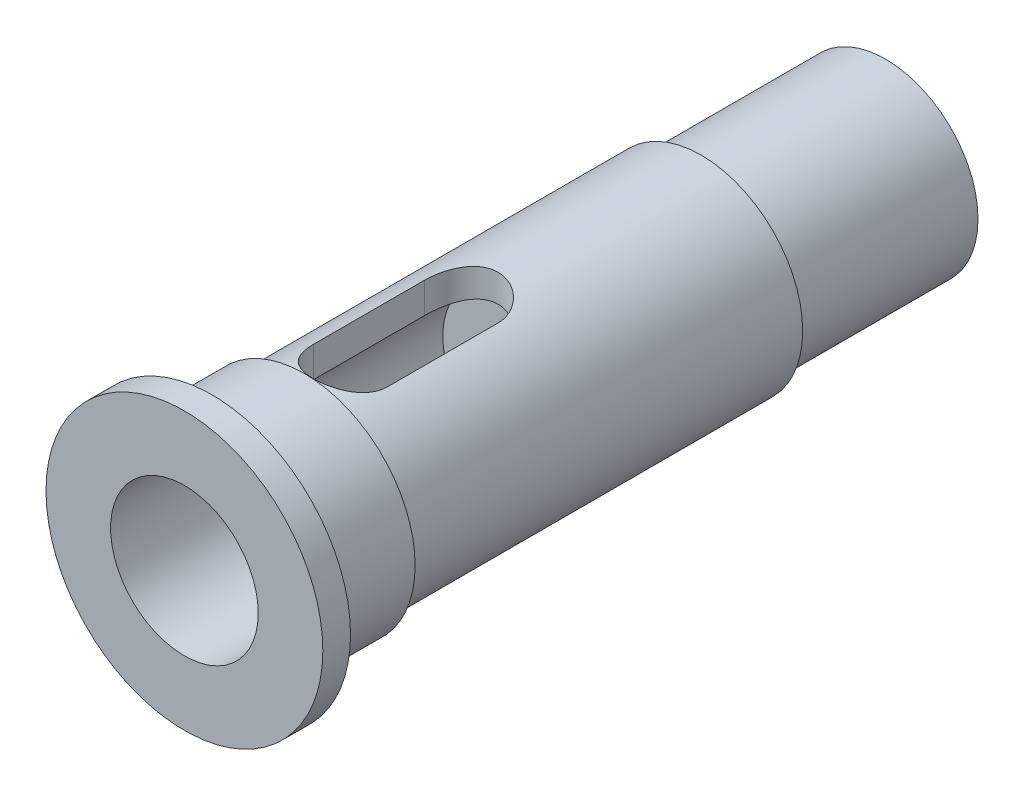
ISO-10303-21;
HEADER;
FILE_DESCRIPTION(('STEP AP214'),'2;1');
FILE_NAME('part.step','',(''),(''),'','','');
FILE_SCHEMA(('AUTOMOTIVE_DESIGN { 1 0 10303 214 1 1 1 1 }'));
ENDSEC;
DATA;
#1=APPLICATION_CONTEXT('core data for automotive mechanical design processes');
#2=APPLICATION_PROTOCOL_DEFINITION('international standard','automotive_design',2000,#1);
#3=PRODUCT_CONTEXT('',#1,'mechanical');
#4=PRODUCT('Part','Part','',(#3));
#5=PRODUCT_RELATED_PRODUCT_CATEGORY('part','',(#4));
#6=PRODUCT_DEFINITION_FORMATION('','',#4);
#7=PRODUCT_DEFINITION_CONTEXT('part definition',#1,'design');
#8=PRODUCT_DEFINITION('design','',#6,#7);
#9=PRODUCT_DEFINITION_SHAPE('','',#8);
#10=(LENGTH_UNIT() NAMED_UNIT(*) SI_UNIT(.MILLI.,.METRE.));
#11=(NAMED_UNIT(*) PLANE_ANGLE_UNIT() SI_UNIT($,.RADIAN.));
#12=(NAMED_UNIT(*) SI_UNIT($,.STERADIAN.) SOLID_ANGLE_UNIT());
#13=UNCERTAINTY_MEASURE_WITH_UNIT(LENGTH_MEASURE(1.E-05),#10,'distance_accuracy_value','');
#14=(GEOMETRIC_REPRESENTATION_CONTEXT(3) GLOBAL_UNCERTAINTY_ASSIGNED_CONTEXT((#13)) GLOBAL_UNIT_ASSIGNED_CONTEXT((#10,
#11,#12)) REPRESENTATION_CONTEXT('',''));
#15=CARTESIAN_POINT('',(0.,0.,0.));
#16=DIRECTION('',(0.,0.,1.));
#17=DIRECTION('',(1.,0.,0.));
#18=AXIS2_PLACEMENT_3D('',#15,#16,#17);
#19=CARTESIAN_POINT('',(0.,0.,38.));
#20=DIRECTION('',(0.,0.,-1.));
#21=DIRECTION('',(-1.,0.,0.));
#22=AXIS2_PLACEMENT_3D('',#19,#20,#21);
#23=CYLINDRICAL_SURFACE('',#22,5.5);
#24=CARTESIAN_POINT('',(0.,0.,31.5));
#25=DIRECTION('',(0.,0.,-1.));
#26=DIRECTION('',(-1.,0.,0.));
#27=AXIS2_PLACEMENT_3D('',#24,#25,#26);
#28=CIRCLE('',#27,5.5);
#29=CARTESIAN_POINT('',(-5.5,0.,31.5));
#30=VERTEX_POINT('',#29);
#31=EDGE_CURVE('E135',#30,#30,#28,.T.);
#32=ORIENTED_EDGE('',*,*,#31,.T.);
#33=EDGE_LOOP('',(#32));
#34=FACE_BOUND('',#33,.T.);
#35=DIRECTION('',(0.,0.,-1.));
#36=VECTOR('',#35,1.);
#37=CARTESIAN_POINT('',(-2.,5.1234753829798,38.));
#38=LINE('',#37,#36);
#39=CARTESIAN_POINT('',(-2.,5.1234753829798,29.));
#40=VERTEX_POINT('',#39);
#41=CARTESIAN_POINT('',(-2.,5.1234753829798,23.));
#42=VERTEX_POINT('',#41);
#43=EDGE_CURVE('E125',#40,#42,#38,.T.);
#44=ORIENTED_EDGE('',*,*,#43,.T.);
#45=CARTESIAN_POINT('',(-2.,5.1234753829798,23.));
#46=CARTESIAN_POINT('',(-2.00000753314808,5.12346565602725,22.9457612205785));
#47=CARTESIAN_POINT('',(-1.99779379827408,5.12433643557664,22.8915277993145));
#48=CARTESIAN_POINT('',(-1.98898255908266,5.12776648446225,22.7834886908159));
#49=CARTESIAN_POINT('',(-1.98238644308809,5.13032521905848,22.7296828735791));
#50=CARTESIAN_POINT('',(-1.96489870016483,5.13704737724638,22.6230613621324));
#51=CARTESIAN_POINT('',(-1.95402164560881,5.14120535590845,22.5702429391552));
#52=CARTESIAN_POINT('',(-1.92808800203303,5.15098705807193,22.4657940511534));
#53=CARTESIAN_POINT('',(-1.91303121833357,5.15661084984592,22.4141636415843));
#54=CARTESIAN_POINT('',(-1.86180702208756,5.1754238494232,22.2616619421114));
#55=CARTESIAN_POINT('',(-1.81955567746144,5.19056699295785,22.1629992148658));
#56=CARTESIAN_POINT('',(-1.72018049401623,5.22433904658501,21.974135282703));
#57=CARTESIAN_POINT('',(-1.6630453414404,5.24297060531306,21.8839405859228));
#58=CARTESIAN_POINT('',(-1.53267714707823,5.28258709667612,21.7103626044192));
#59=CARTESIAN_POINT('',(-1.45886670296494,5.30363814939348,21.6274271533525));
#60=CARTESIAN_POINT('',(-1.29847293044523,5.34516826987225,21.4748016084848));
#61=CARTESIAN_POINT('',(-1.21188719525374,5.36564722898827,21.4051140161713));
#62=CARTESIAN_POINT('',(-1.02500969613478,5.40451062749925,21.2788183994836));
#63=CARTESIAN_POINT('',(-0.924370090053192,5.42280793854183,21.2226958146311));
#64=CARTESIAN_POINT('',(-0.714299107302069,5.45445105820857,21.12836416537));
#65=CARTESIAN_POINT('',(-0.604870855549386,5.46779861738183,21.0901487665713));
#66=CARTESIAN_POINT('',(-0.385063057544165,5.48756774300281,21.0342798994265));
#67=CARTESIAN_POINT('',(-0.27490440306594,5.49424962399435,21.0158512598948));
#68=CARTESIAN_POINT('',(-0.0528669835238512,5.50086592457488,20.9976006188544));
#69=CARTESIAN_POINT('',(0.0590112772595836,5.50080228593927,20.9977732627528));
#70=CARTESIAN_POINT('',(0.275772559853019,5.49410312303007,21.0162581100276));
#71=CARTESIAN_POINT('',(0.380738725262411,5.487773764585,21.0337252484304));
#72=CARTESIAN_POINT('',(0.586131937099524,5.46965116666239,21.0848882566854));
#73=CARTESIAN_POINT('',(0.686558725995575,5.45785761761182,21.1185850460306));
#74=CARTESIAN_POINT('',(0.881716601365395,5.42977365386104,21.2016710964535));
#75=CARTESIAN_POINT('',(0.976346250593864,5.41342161172991,21.2512769270653));
#76=CARTESIAN_POINT('',(1.15616748204336,5.37788902184763,21.3645857848175));
#77=CARTESIAN_POINT('',(1.24135610896621,5.35870759277619,21.4282932075422));
#78=CARTESIAN_POINT('',(1.40486489489799,5.31825524364858,21.5721153952122));
#79=CARTESIAN_POINT('',(1.48254558886144,5.29692743161349,21.6529421595894));
#80=CARTESIAN_POINT('',(1.62349341794031,5.25544299978234,21.8266369054807));
#81=CARTESIAN_POINT('',(1.68675521974002,5.23528681539943,21.9195093226226));
#82=CARTESIAN_POINT('',(1.79820509788062,5.19807570266242,22.1170608114601));
#83=CARTESIAN_POINT('',(1.84606144182333,5.18109196181225,22.2219411343657));
#84=CARTESIAN_POINT('',(1.92314470149137,5.15298201497764,22.4389975550166));
#85=CARTESIAN_POINT('',(1.95240231114569,5.14184616339463,22.551161293755));
#86=CARTESIAN_POINT('',(1.98115331401841,5.13080109153432,22.7203787839042));
#87=CARTESIAN_POINT('',(1.98821538805374,5.12806368923517,22.7760589118387));
#88=CARTESIAN_POINT('',(1.99763703693586,5.12439847706825,22.8878154357511));
#89=CARTESIAN_POINT('',(2.00000152980534,5.12346877469309,22.9438913555533));
#90=CARTESIAN_POINT('',(2.,5.1234753829798,23.));
#91=B_SPLINE_CURVE_WITH_KNOTS('',3,(#45,#46,#47,#48,#49,#50,#51,#52,#53,#54,#55,#56,#57,#58,#59,
#60,#61,#62,#63,#64,#65,#66,#67,#68,#69,#70,#71,#72,#73,#74,#75,#76,#77,#78,#79,#80,#81,#82,#83,
#84,#85,#86,#87,#88,#89,#90),.UNSPECIFIED.,.F.,.F.,(4,2,2,2,2,2,2,2,2,2,2,2,2,2,2,2,2,2,2,2,2,2,
4),(0.,0.162655197714174,0.325258891390915,0.487313801745629,0.649376261416068,
0.972956522661164,1.29678347113773,1.63427074689126,1.97182168451613,2.32008820197742,
2.66823143237219,3.00217322695472,3.33601889281301,3.65431862991543,3.97263640245517,
4.29548576025188,4.6184358949683,4.95922780644115,5.30014556751897,5.64797750864198,
5.99523391397707,6.16361511870677,6.33181994758312),.UNSPECIFIED.);
#92=CARTESIAN_POINT('',(2.,5.1234753829798,23.));
#93=VERTEX_POINT('',#92);
#94=EDGE_CURVE('E202',#42,#93,#91,.T.);
#95=ORIENTED_EDGE('',*,*,#94,.T.);
#96=DIRECTION('',(0.,0.,-1.));
#97=VECTOR('',#96,1.);
#98=CARTESIAN_POINT('',(2.,5.1234753829798,38.));
#99=LINE('',#98,#97);
#100=CARTESIAN_POINT('',(2.,5.1234753829798,29.));
#101=VERTEX_POINT('',#100);
#102=EDGE_CURVE('E198',#93,#101,#99,.F.);
#103=ORIENTED_EDGE('',*,*,#102,.T.);
#104=CARTESIAN_POINT('',(2.,5.1234753829798,29.));
#105=CARTESIAN_POINT('',(2.00000753314808,5.12346565602725,29.0542387794215));
#106=CARTESIAN_POINT('',(1.99779379827409,5.12433643557664,29.1084722006855));
#107=CARTESIAN_POINT('',(1.98898255908266,5.12776648446225,29.216511309184));
#108=CARTESIAN_POINT('',(1.98238644308809,5.13032521905848,29.2703171264209));
#109=CARTESIAN_POINT('',(1.96489870016483,5.13704737724638,29.3769386378676));
#110=CARTESIAN_POINT('',(1.95402164560881,5.14120535590845,29.4297570608448));
#111=CARTESIAN_POINT('',(1.92808800203303,5.15098705807193,29.5342059488466));
#112=CARTESIAN_POINT('',(1.91303121833357,5.15661084984592,29.5858363584157));
#113=CARTESIAN_POINT('',(1.86180702208756,5.1754238494232,29.7383380578886));
#114=CARTESIAN_POINT('',(1.81955567746145,5.19056699295785,29.8370007851342));
#115=CARTESIAN_POINT('',(1.72018049401623,5.22433904658501,30.025864717297));
#116=CARTESIAN_POINT('',(1.6630453414404,5.24297060531306,30.1160594140772));
#117=CARTESIAN_POINT('',(1.53267714707823,5.28258709667611,30.2896373955808));
#118=CARTESIAN_POINT('',(1.45886670296494,5.30363814939348,30.3725728466475));
#119=CARTESIAN_POINT('',(1.29847293044524,5.34516826987225,30.5251983915152));
#120=CARTESIAN_POINT('',(1.21188719525374,5.36564722898827,30.5948859838287));
#121=CARTESIAN_POINT('',(1.02500969613479,5.40451062749925,30.7211816005164));
#122=CARTESIAN_POINT('',(0.924370090053193,5.42280793854183,30.7773041853689));
#123=CARTESIAN_POINT('',(0.714299107302071,5.45445105820857,30.87163583463));
#124=CARTESIAN_POINT('',(0.604870855549388,5.46779861738183,30.9098512334287));
#125=CARTESIAN_POINT('',(0.385063057544167,5.48756774300281,30.9657201005735));
#126=CARTESIAN_POINT('',(0.274904403065942,5.49424962399435,30.9841487401052));
#127=CARTESIAN_POINT('',(0.0528669835238529,5.50086592457488,31.0023993811456));
#128=CARTESIAN_POINT('',(-0.0590112772595817,5.50080228593927,31.0022267372472));
#129=CARTESIAN_POINT('',(-0.275772559853017,5.49410312303007,30.9837418899724));
#130=CARTESIAN_POINT('',(-0.380738725262409,5.487773764585,30.9662747515696));
#131=CARTESIAN_POINT('',(-0.586131937099522,5.46965116666239,30.9151117433146));
#132=CARTESIAN_POINT('',(-0.686558725995573,5.45785761761182,30.8814149539694));
#133=CARTESIAN_POINT('',(-0.881716601365394,5.42977365386104,30.7983289035465));
#134=CARTESIAN_POINT('',(-0.976346250593862,5.41342161172991,30.7487230729347));
#135=CARTESIAN_POINT('',(-1.15616748204336,5.37788902184764,30.6354142151825));
#136=CARTESIAN_POINT('',(-1.24135610896621,5.35870759277619,30.5717067924578));
#137=CARTESIAN_POINT('',(-1.40486489489799,5.31825524364858,30.4278846047878));
#138=CARTESIAN_POINT('',(-1.48254558886144,5.29692743161349,30.3470578404106));
#139=CARTESIAN_POINT('',(-1.6234934179403,5.25544299978234,30.1733630945193));
#140=CARTESIAN_POINT('',(-1.68675521974002,5.23528681539943,30.0804906773774));
#141=CARTESIAN_POINT('',(-1.79820509788062,5.19807570266242,29.8829391885399));
#142=CARTESIAN_POINT('',(-1.84606144182333,5.18109196181225,29.7780588656343));
#143=CARTESIAN_POINT('',(-1.92314470149137,5.15298201497764,29.5610024449834));
#144=CARTESIAN_POINT('',(-1.95240231114569,5.14184616339463,29.448838706245));
#145=CARTESIAN_POINT('',(-1.98115331401841,5.13080109153432,29.2796212160958));
#146=CARTESIAN_POINT('',(-1.98821538805374,5.12806368923518,29.2239410881613));
#147=CARTESIAN_POINT('',(-1.99763703693586,5.12439847706826,29.1121845642489));
#148=CARTESIAN_POINT('',(-2.00000152980534,5.1234687746931,29.0561086444467));
#149=CARTESIAN_POINT('',(-2.,5.1234753829798,29.));
#150=B_SPLINE_CURVE_WITH_KNOTS('',3,(#104,#105,#106,#107,#108,#109,#110,#111,#112,#113,#114,
#115,#116,#117,#118,#119,#120,#121,#122,#123,#124,#125,#126,#127,#128,#129,#130,#131,#132,#133,
#134,#135,#136,#137,#138,#139,#140,#141,#142,#143,#144,#145,#146,#147,#148,#149),.UNSPECIFIED.,
.F.,.F.,(4,2,2,2,2,2,2,2,2,2,2,2,2,2,2,2,2,2,2,2,2,2,4),(0.,0.162655197714174,0.325258891390911,
0.487313801745629,0.649376261416068,0.972956522661164,1.29678347113773,1.63427074689126,
1.97182168451613,2.32008820197742,2.66823143237219,3.00217322695472,3.33601889281301,
3.65431862991543,3.97263640245517,4.29548576025188,4.6184358949683,4.95922780644115,
5.30014556751896,5.64797750864198,5.99523391397707,6.16361511870677,6.33181994758312),.UNSPECIFIED.);
#151=EDGE_CURVE('E89',#101,#40,#150,.T.);
#152=ORIENTED_EDGE('',*,*,#151,.T.);
#153=EDGE_LOOP('',(#44,#95,#103,#152));
#154=FACE_BOUND('',#153,.T.);
#155=CARTESIAN_POINT('',(0.,0.,10.));
#156=DIRECTION('',(0.,0.,-1.));
#157=DIRECTION('',(-1.,0.,0.));
#158=AXIS2_PLACEMENT_3D('',#155,#156,#157);
#159=CIRCLE('',#158,5.5);
#160=CARTESIAN_POINT('',(-5.5,0.,10.));
#161=VERTEX_POINT('',#160);
#162=EDGE_CURVE('E42',#161,#161,#159,.T.);
#163=ORIENTED_EDGE('',*,*,#162,.F.);
#164=EDGE_LOOP('',(#163));
#165=FACE_BOUND('',#164,.T.);
#166=ADVANCED_FACE('F38',(#34,#154,#165),#23,.T.);
#167=CARTESIAN_POINT('',(0.,0.,36.5));
#168=DIRECTION('',(0.,0.,1.));
#169=DIRECTION('',(1.,0.,0.));
#170=AXIS2_PLACEMENT_3D('',#167,#168,#169);
#171=PLANE('',#170);
#172=CARTESIAN_POINT('',(0.,0.,36.5));
#173=DIRECTION('',(0.,0.,1.));
#174=DIRECTION('',(1.,0.,0.));
#175=AXIS2_PLACEMENT_3D('',#172,#173,#174);
#176=CIRCLE('',#175,7.5);
#177=CARTESIAN_POINT('',(7.5,0.,36.5));
#178=VERTEX_POINT('',#177);
#179=EDGE_CURVE('E136',#178,#178,#176,.T.);
#180=ORIENTED_EDGE('',*,*,#179,.F.);
#181=EDGE_LOOP('',(#180));
#182=FACE_BOUND('',#181,.T.);
#183=CARTESIAN_POINT('',(0.,0.,36.5));
#184=DIRECTION('',(0.,0.,1.));
#185=DIRECTION('',(1.,0.,0.));
#186=AXIS2_PLACEMENT_3D('',#183,#184,#185);
#187=CIRCLE('',#186,6.);
#188=CARTESIAN_POINT('',(6.,0.,36.5));
#189=VERTEX_POINT('',#188);
#190=EDGE_CURVE('E83',#189,#189,#187,.F.);
#191=ORIENTED_EDGE('',*,*,#190,.F.);
#192=EDGE_LOOP('',(#191));
#193=FACE_BOUND('',#192,.T.);
#194=ADVANCED_FACE('F164',(#182,#193),#171,.F.);
#195=CARTESIAN_POINT('',(0.,0.,36.5));
#196=DIRECTION('',(0.,0.,1.));
#197=DIRECTION('',(1.,0.,0.));
#198=AXIS2_PLACEMENT_3D('',#195,#196,#197);
#199=CYLINDRICAL_SURFACE('',#198,7.5);
#200=ORIENTED_EDGE('',*,*,#179,.T.);
#201=EDGE_LOOP('',(#200));
#202=FACE_BOUND('',#201,.T.);
#203=CARTESIAN_POINT('',(0.,0.,38.));
#204=DIRECTION('',(0.,0.,1.));
#205=DIRECTION('',(1.,0.,0.));
#206=AXIS2_PLACEMENT_3D('',#203,#204,#205);
#207=CIRCLE('',#206,7.5);
#208=CARTESIAN_POINT('',(7.5,0.,38.));
#209=VERTEX_POINT('',#208);
#210=EDGE_CURVE('E139',#209,#209,#207,.T.);
#211=ORIENTED_EDGE('',*,*,#210,.F.);
#212=EDGE_LOOP('',(#211));
#213=FACE_BOUND('',#212,.T.);
#214=ADVANCED_FACE('F160',(#202,#213),#199,.T.);
#215=CARTESIAN_POINT('',(0.,0.,38.));
#216=DIRECTION('',(0.,0.,1.));
#217=DIRECTION('',(1.,0.,0.));
#218=AXIS2_PLACEMENT_3D('',#215,#216,#217);
#219=PLANE('',#218);
#220=CARTESIAN_POINT('',(0.,0.,38.));
#221=DIRECTION('',(0.,0.,1.));
#222=DIRECTION('',(1.,0.,0.));
#223=AXIS2_PLACEMENT_3D('',#220,#221,#222);
#224=CIRCLE('',#223,4.);
#225=CARTESIAN_POINT('',(4.,0.,38.));
#226=VERTEX_POINT('',#225);
#227=EDGE_CURVE('E124',#226,#226,#224,.T.);
#228=ORIENTED_EDGE('',*,*,#227,.F.);
#229=EDGE_LOOP('',(#228));
#230=FACE_BOUND('',#229,.T.);
#231=ORIENTED_EDGE('',*,*,#210,.T.);
#232=EDGE_LOOP('',(#231));
#233=FACE_BOUND('',#232,.T.);
#234=ADVANCED_FACE('F152',(#230,#233),#219,.T.);
#235=CARTESIAN_POINT('',(0.,0.,31.5));
#236=DIRECTION('',(0.,0.,-1.));
#237=DIRECTION('',(-1.,0.,0.));
#238=AXIS2_PLACEMENT_3D('',#235,#236,#237);
#239=PLANE('',#238);
#240=CARTESIAN_POINT('',(0.,0.,31.5));
#241=DIRECTION('',(0.,0.,-1.));
#242=DIRECTION('',(-1.,0.,0.));
#243=AXIS2_PLACEMENT_3D('',#240,#241,#242);
#244=CIRCLE('',#243,6.);
#245=CARTESIAN_POINT('',(-6.,0.,31.5));
#246=VERTEX_POINT('',#245);
#247=EDGE_CURVE('E130',#246,#246,#244,.T.);
#248=ORIENTED_EDGE('',*,*,#247,.T.);
#249=EDGE_LOOP('',(#248));
#250=FACE_BOUND('',#249,.T.);
#251=ORIENTED_EDGE('',*,*,#31,.F.);
#252=EDGE_LOOP('',(#251));
#253=FACE_BOUND('',#252,.T.);
#254=ADVANCED_FACE('F149',(#250,#253),#239,.T.);
#255=CARTESIAN_POINT('',(0.,0.,31.5));
#256=DIRECTION('',(0.,0.,1.));
#257=DIRECTION('',(1.,0.,0.));
#258=AXIS2_PLACEMENT_3D('',#255,#256,#257);
#259=CYLINDRICAL_SURFACE('',#258,6.);
#260=ORIENTED_EDGE('',*,*,#247,.F.);
#261=EDGE_LOOP('',(#260));
#262=FACE_BOUND('',#261,.T.);
#263=ORIENTED_EDGE('',*,*,#190,.T.);
#264=EDGE_LOOP('',(#263));
#265=FACE_BOUND('',#264,.T.);
#266=ADVANCED_FACE('F151',(#262,#265),#259,.T.);
#267=CARTESIAN_POINT('',(0.,0.,20.));
#268=DIRECTION('',(0.,0.,1.));
#269=DIRECTION('',(1.,0.,0.));
#270=AXIS2_PLACEMENT_3D('',#267,#268,#269);
#271=CYLINDRICAL_SURFACE('',#270,4.);
#272=DIRECTION('',(0.,0.,1.));
#273=VECTOR('',#272,1.);
#274=CARTESIAN_POINT('',(-2.,3.46410161513776,20.));
#275=LINE('',#274,#273);
#276=CARTESIAN_POINT('',(-2.,3.46410161513776,23.));
#277=VERTEX_POINT('',#276);
#278=CARTESIAN_POINT('',(-2.,3.46410161513776,29.));
#279=VERTEX_POINT('',#278);
#280=EDGE_CURVE('E47',#277,#279,#275,.T.);
#281=ORIENTED_EDGE('',*,*,#280,.T.);
#282=CARTESIAN_POINT('',(-2.,3.46410161513776,29.));
#283=CARTESIAN_POINT('',(-2.00000943869001,3.46408620970987,29.0523779480253));
#284=CARTESIAN_POINT('',(-1.99794273869157,3.46528916979241,29.1047473358212));
#285=CARTESIAN_POINT('',(-1.98973134530659,3.47001582547733,29.2090287198757));
#286=CARTESIAN_POINT('',(-1.98358915744987,3.47353809520359,29.2609409773126));
#287=CARTESIAN_POINT('',(-1.96734758392331,3.48276113120576,29.3636380261954));
#288=CARTESIAN_POINT('',(-1.95727108055602,3.48844929580341,29.4144275743706));
#289=CARTESIAN_POINT('',(-1.93329379612756,3.50179425827599,29.5148220912702));
#290=CARTESIAN_POINT('',(-1.91939257579648,3.50945128226841,29.5644269232179));
#291=CARTESIAN_POINT('',(-1.87223751000492,3.53496971479961,29.7107712252712));
#292=CARTESIAN_POINT('',(-1.83348206518134,3.55540886386695,29.805351141825));
#293=CARTESIAN_POINT('',(-1.74260973580062,3.60081691495323,29.9867335487003));
#294=CARTESIAN_POINT('',(-1.69047214803722,3.62579281802088,30.0735237043089));
#295=CARTESIAN_POINT('',(-1.56932700935895,3.67994024124641,30.2446169139103));
#296=CARTESIAN_POINT('',(-1.49928845749502,3.70928784184414,30.3281359831156));
#297=CARTESIAN_POINT('',(-1.34648855278875,3.76744628526357,30.4828341717636));
#298=CARTESIAN_POINT('',(-1.2637237596621,3.79625698057539,30.5540099433393));
#299=CARTESIAN_POINT('',(-1.08097958990492,3.852429394718,30.6867336579076));
#300=CARTESIAN_POINT('',(-0.980215181611717,3.87956191127973,30.7473069679902));
#301=CARTESIAN_POINT('',(-0.768314880691173,3.92701497394428,30.8502814812865));
#302=CARTESIAN_POINT('',(-0.657185507148496,3.94733976534538,30.8926940141749));
#303=CARTESIAN_POINT('',(-0.436090764194853,3.97760910429472,30.9550090539269));
#304=CARTESIAN_POINT('',(-0.326605376453686,3.98818943198116,30.9762986994008));
#305=CARTESIAN_POINT('',(-0.105143090997523,4.00015165315059,31.0003321965565));
#306=CARTESIAN_POINT('',(0.00683230076447209,4.0015389624913,31.0030869676528));
#307=CARTESIAN_POINT('',(0.219666020360655,3.99525960973526,30.9905065944354));
#308=CARTESIAN_POINT('',(0.32064432992476,3.98836978544159,30.9767237081556));
#309=CARTESIAN_POINT('',(0.518629401924055,3.96748463780782,30.9342377597476));
#310=CARTESIAN_POINT('',(0.615635942593484,3.9534889182895,30.9055338657197));
#311=CARTESIAN_POINT('',(0.80461807413788,3.91943179430851,30.8338351517342));
#312=CARTESIAN_POINT('',(0.896505473959441,3.89928913517567,30.7906480757701));
#313=CARTESIAN_POINT('',(1.07195237395391,3.85475327589208,30.6914739364965));
#314=CARTESIAN_POINT('',(1.15550875300778,3.83035849206883,30.6354821017162));
#315=CARTESIAN_POINT('',(1.32034170525748,3.77688971838165,30.5062139192586));
#316=CARTESIAN_POINT('',(1.40065758878075,3.74759139866565,30.4318045518153));
#317=CARTESIAN_POINT('',(1.54820014968351,3.6890905267488,30.27083083878));
#318=CARTESIAN_POINT('',(1.61541504384544,3.65988808377385,30.1842556704133));
#319=CARTESIAN_POINT('',(1.73905371288664,3.60286331192321,29.9946405458574));
#320=CARTESIAN_POINT('',(1.79450839108784,3.57524975585781,29.8909005828144));
#321=CARTESIAN_POINT('',(1.88669118631508,3.52747996877226,29.673954025224));
#322=CARTESIAN_POINT('',(1.92346416437439,3.50730590530613,29.5607708759258));
#323=CARTESIAN_POINT('',(1.96647223368324,3.48329612458051,29.3721781694384));
#324=CARTESIAN_POINT('',(1.97899117486891,3.47616914725418,29.2985740476968));
#325=CARTESIAN_POINT('',(1.99577612591724,3.46654103519923,29.1500070640767));
#326=CARTESIAN_POINT('',(2.00002756701619,3.4640480667353,29.0750420381721));
#327=CARTESIAN_POINT('',(2.,3.46410161513775,29.));
#328=B_SPLINE_CURVE_WITH_KNOTS('',3,(#282,#283,#284,#285,#286,#287,#288,#289,#290,#291,#292,
#293,#294,#295,#296,#297,#298,#299,#300,#301,#302,#303,#304,#305,#306,#307,#308,#309,#310,#311,
#312,#313,#314,#315,#316,#317,#318,#319,#320,#321,#322,#323,#324,#325,#326,#327),.UNSPECIFIED.,
.F.,.F.,(4,2,2,2,2,2,2,2,2,2,2,2,2,2,2,2,2,2,2,2,2,2,4),(0.,0.157065244429693,0.314034017590654,
0.470103130002193,0.626190174486595,0.937427814388441,1.24914989609589,1.58636722175674,
1.92367586815313,2.28376091120869,2.643620985295,2.97787141914153,3.31192491942518,
3.61692930404831,3.92195069558821,4.23119285312315,4.54055043268371,4.87912635702851,
5.21800541026928,5.57862778091816,5.93838003367367,6.16281283132481,6.38764076123999),.UNSPECIFIED.);
#329=CARTESIAN_POINT('',(2.,3.46410161513776,29.));
#330=VERTEX_POINT('',#329);
#331=EDGE_CURVE('E12',#279,#330,#328,.T.);
#332=ORIENTED_EDGE('',*,*,#331,.T.);
#333=DIRECTION('',(0.,0.,1.));
#334=VECTOR('',#333,1.);
#335=CARTESIAN_POINT('',(2.,3.46410161513776,20.));
#336=LINE('',#335,#334);
#337=CARTESIAN_POINT('',(2.,3.46410161513776,23.));
#338=VERTEX_POINT('',#337);
#339=EDGE_CURVE('E78',#330,#338,#336,.F.);
#340=ORIENTED_EDGE('',*,*,#339,.T.);
#341=CARTESIAN_POINT('',(2.,3.46410161513775,23.));
#342=CARTESIAN_POINT('',(2.00000943869001,3.46408620970987,22.9476220519747));
#343=CARTESIAN_POINT('',(1.99794273869157,3.46528916979241,22.8952526641788));
#344=CARTESIAN_POINT('',(1.98973134530659,3.47001582547733,22.7909712801243));
#345=CARTESIAN_POINT('',(1.98358915744987,3.47353809520359,22.7390590226874));
#346=CARTESIAN_POINT('',(1.96734758392331,3.48276113120576,22.6363619738046));
#347=CARTESIAN_POINT('',(1.95727108055602,3.48844929580341,22.5855724256294));
#348=CARTESIAN_POINT('',(1.93329379612757,3.50179425827599,22.4851779087298));
#349=CARTESIAN_POINT('',(1.91939257579648,3.5094512822684,22.4355730767821));
#350=CARTESIAN_POINT('',(1.87223751000493,3.53496971479961,22.2892287747288));
#351=CARTESIAN_POINT('',(1.83348206518134,3.55540886386695,22.194648858175));
#352=CARTESIAN_POINT('',(1.74260973580062,3.60081691495323,22.0132664512997));
#353=CARTESIAN_POINT('',(1.69047214803722,3.62579281802088,21.9264762956911));
#354=CARTESIAN_POINT('',(1.56932700935895,3.67994024124641,21.7553830860897));
#355=CARTESIAN_POINT('',(1.49928845749502,3.70928784184414,21.6718640168844));
#356=CARTESIAN_POINT('',(1.34648855278875,3.76744628526356,21.5171658282364));
#357=CARTESIAN_POINT('',(1.2637237596621,3.79625698057539,21.4459900566607));
#358=CARTESIAN_POINT('',(1.08097958990492,3.852429394718,21.3132663420924));
#359=CARTESIAN_POINT('',(0.980215181611718,3.87956191127973,21.2526930320098));
#360=CARTESIAN_POINT('',(0.768314880691173,3.92701497394428,21.1497185187135));
#361=CARTESIAN_POINT('',(0.657185507148497,3.94733976534538,21.107305985825));
#362=CARTESIAN_POINT('',(0.436090764194854,3.97760910429472,21.0449909460731));
#363=CARTESIAN_POINT('',(0.326605376453687,3.98818943198116,21.0237013005992));
#364=CARTESIAN_POINT('',(0.105143090997524,4.00015165315059,20.9996678034435));
#365=CARTESIAN_POINT('',(-0.00683230076447046,4.0015389624913,20.9969130323472));
#366=CARTESIAN_POINT('',(-0.219666020360653,3.99525960973526,21.0094934055646));
#367=CARTESIAN_POINT('',(-0.320644329924759,3.98836978544159,21.0232762918444));
#368=CARTESIAN_POINT('',(-0.518629401924053,3.96748463780783,21.0657622402524));
#369=CARTESIAN_POINT('',(-0.615635942593482,3.9534889182895,21.0944661342803));
#370=CARTESIAN_POINT('',(-0.804618074137877,3.91943179430851,21.1661648482658));
#371=CARTESIAN_POINT('',(-0.896505473959436,3.89928913517567,21.2093519242299));
#372=CARTESIAN_POINT('',(-1.0719523739539,3.85475327589208,21.3085260635035));
#373=CARTESIAN_POINT('',(-1.15550875300778,3.83035849206883,21.3645178982838));
#374=CARTESIAN_POINT('',(-1.32034170525747,3.77688971838165,21.4937860807414));
#375=CARTESIAN_POINT('',(-1.40065758878075,3.74759139866565,21.5681954481847));
#376=CARTESIAN_POINT('',(-1.54820014968351,3.6890905267488,21.72916916122));
#377=CARTESIAN_POINT('',(-1.61541504384544,3.65988808377385,21.8157443295867));
#378=CARTESIAN_POINT('',(-1.73905371288663,3.60286331192321,22.0053594541426));
#379=CARTESIAN_POINT('',(-1.79450839108784,3.57524975585781,22.1090994171856));
#380=CARTESIAN_POINT('',(-1.88669118631508,3.52747996877227,22.326045974776));
#381=CARTESIAN_POINT('',(-1.92346416437439,3.50730590530614,22.4392291240742));
#382=CARTESIAN_POINT('',(-1.96647223368324,3.48329612458051,22.6278218305616));
#383=CARTESIAN_POINT('',(-1.9789911748689,3.47616914725418,22.7014259523032));
#384=CARTESIAN_POINT('',(-1.99577612591723,3.46654103519923,22.8499929359233));
#385=CARTESIAN_POINT('',(-2.00002756701619,3.4640480667353,22.9249579618279));
#386=CARTESIAN_POINT('',(-2.,3.46410161513776,23.));
#387=B_SPLINE_CURVE_WITH_KNOTS('',3,(#341,#342,#343,#344,#345,#346,#347,#348,#349,#350,#351,
#352,#353,#354,#355,#356,#357,#358,#359,#360,#361,#362,#363,#364,#365,#366,#367,#368,#369,#370,
#371,#372,#373,#374,#375,#376,#377,#378,#379,#380,#381,#382,#383,#384,#385,#386),.UNSPECIFIED.,
.F.,.F.,(4,2,2,2,2,2,2,2,2,2,2,2,2,2,2,2,2,2,2,2,2,2,4),(0.,0.157065244429693,0.314034017590654,
0.470103130002189,0.626190174486595,0.937427814388441,1.24914989609589,1.58636722175674,
1.92367586815313,2.28376091120869,2.643620985295,2.97787141914153,3.31192491942518,
3.61692930404831,3.92195069558821,4.23119285312315,4.54055043268371,4.87912635702851,
5.21800541026928,5.57862778091816,5.93838003367367,6.16281283132481,6.38764076123999),.UNSPECIFIED.);
#388=EDGE_CURVE('E82',#338,#277,#387,.T.);
#389=ORIENTED_EDGE('',*,*,#388,.T.);
#390=EDGE_LOOP('',(#281,#332,#340,#389));
#391=FACE_BOUND('',#390,.T.);
#392=CARTESIAN_POINT('',(0.,0.,20.));
#393=DIRECTION('',(0.,0.,1.));
#394=DIRECTION('',(1.,0.,0.));
#395=AXIS2_PLACEMENT_3D('',#392,#393,#394);
#396=CIRCLE('',#395,4.);
#397=CARTESIAN_POINT('',(4.,0.,20.));
#398=VERTEX_POINT('',#397);
#399=EDGE_CURVE('E127',#398,#398,#396,.T.);
#400=ORIENTED_EDGE('',*,*,#399,.F.);
#401=EDGE_LOOP('',(#400));
#402=FACE_BOUND('',#401,.T.);
#403=ORIENTED_EDGE('',*,*,#227,.T.);
#404=EDGE_LOOP('',(#403));
#405=FACE_BOUND('',#404,.T.);
#406=ADVANCED_FACE('F93',(#391,#402,#405),#271,.F.);
#407=CARTESIAN_POINT('',(0.,0.,20.));
#408=DIRECTION('',(0.,0.,1.));
#409=DIRECTION('',(1.,0.,0.));
#410=AXIS2_PLACEMENT_3D('',#407,#408,#409);
#411=PLANE('',#410);
#412=ORIENTED_EDGE('',*,*,#399,.T.);
#413=EDGE_LOOP('',(#412));
#414=FACE_BOUND('',#413,.T.);
#415=ADVANCED_FACE('F116',(#414),#411,.T.);
#416=CARTESIAN_POINT('',(0.,3.,29.));
#417=DIRECTION('',(0.,1.,0.));
#418=DIRECTION('',(0.,0.,1.));
#419=AXIS2_PLACEMENT_3D('',#416,#417,#418);
#420=CYLINDRICAL_SURFACE('',#419,2.);
#421=DIRECTION('',(0.,1.,0.));
#422=VECTOR('',#421,1.);
#423=CARTESIAN_POINT('',(2.,3.,29.));
#424=LINE('',#423,#422);
#425=EDGE_CURVE('E54',#330,#101,#424,.T.);
#426=ORIENTED_EDGE('',*,*,#425,.F.);
#427=ORIENTED_EDGE('',*,*,#331,.F.);
#428=DIRECTION('',(0.,1.,0.));
#429=VECTOR('',#428,1.);
#430=CARTESIAN_POINT('',(-2.,3.,29.));
#431=LINE('',#430,#429);
#432=EDGE_CURVE('E196',#279,#40,#431,.T.);
#433=ORIENTED_EDGE('',*,*,#432,.T.);
#434=ORIENTED_EDGE('',*,*,#151,.F.);
#435=EDGE_LOOP('',(#426,#427,#433,#434));
#436=FACE_BOUND('',#435,.T.);
#437=ADVANCED_FACE('F86',(#436),#420,.F.);
#438=CARTESIAN_POINT('',(-2.,3.,29.));
#439=DIRECTION('',(-1.,0.,0.));
#440=DIRECTION('',(0.,0.,1.));
#441=AXIS2_PLACEMENT_3D('',#438,#439,#440);
#442=PLANE('',#441);
#443=ORIENTED_EDGE('',*,*,#432,.F.);
#444=ORIENTED_EDGE('',*,*,#280,.F.);
#445=DIRECTION('',(0.,1.,0.));
#446=VECTOR('',#445,1.);
#447=CARTESIAN_POINT('',(-2.,3.,23.));
#448=LINE('',#447,#446);
#449=EDGE_CURVE('E199',#277,#42,#448,.T.);
#450=ORIENTED_EDGE('',*,*,#449,.T.);
#451=ORIENTED_EDGE('',*,*,#43,.F.);
#452=EDGE_LOOP('',(#443,#444,#450,#451));
#453=FACE_BOUND('',#452,.T.);
#454=ADVANCED_FACE('F115',(#453),#442,.F.);
#455=CARTESIAN_POINT('',(0.,3.,23.));
#456=DIRECTION('',(0.,1.,0.));
#457=DIRECTION('',(0.,0.,1.));
#458=AXIS2_PLACEMENT_3D('',#455,#456,#457);
#459=CYLINDRICAL_SURFACE('',#458,2.);
#460=ORIENTED_EDGE('',*,*,#449,.F.);
#461=ORIENTED_EDGE('',*,*,#388,.F.);
#462=DIRECTION('',(0.,1.,0.));
#463=VECTOR('',#462,1.);
#464=CARTESIAN_POINT('',(2.,3.,23.));
#465=LINE('',#464,#463);
#466=EDGE_CURVE('E59',#338,#93,#465,.T.);
#467=ORIENTED_EDGE('',*,*,#466,.T.);
#468=ORIENTED_EDGE('',*,*,#94,.F.);
#469=EDGE_LOOP('',(#460,#461,#467,#468));
#470=FACE_BOUND('',#469,.T.);
#471=ADVANCED_FACE('F206',(#470),#459,.F.);
#472=CARTESIAN_POINT('',(2.,3.,29.));
#473=DIRECTION('',(1.,0.,0.));
#474=DIRECTION('',(0.,0.,-1.));
#475=AXIS2_PLACEMENT_3D('',#472,#473,#474);
#476=PLANE('',#475);
#477=ORIENTED_EDGE('',*,*,#466,.F.);
#478=ORIENTED_EDGE('',*,*,#339,.F.);
#479=ORIENTED_EDGE('',*,*,#425,.T.);
#480=ORIENTED_EDGE('',*,*,#102,.F.);
#481=EDGE_LOOP('',(#477,#478,#479,#480));
#482=FACE_BOUND('',#481,.T.);
#483=ADVANCED_FACE('F79',(#482),#476,.F.);
#484=CARTESIAN_POINT('',(0.,0.,10.));
#485=DIRECTION('',(0.,0.,-1.));
#486=DIRECTION('',(-1.,0.,0.));
#487=AXIS2_PLACEMENT_3D('',#484,#485,#486);
#488=PLANE('',#487);
#489=CARTESIAN_POINT('',(0.,0.,10.));
#490=DIRECTION('',(0.,0.,-1.));
#491=DIRECTION('',(-1.,0.,0.));
#492=AXIS2_PLACEMENT_3D('',#489,#490,#491);
#493=CIRCLE('',#492,5.);
#494=CARTESIAN_POINT('',(-5.,0.,10.));
#495=VERTEX_POINT('',#494);
#496=EDGE_CURVE('E191',#495,#495,#493,.T.);
#497=ORIENTED_EDGE('',*,*,#496,.F.);
#498=EDGE_LOOP('',(#497));
#499=FACE_BOUND('',#498,.T.);
#500=ORIENTED_EDGE('',*,*,#162,.T.);
#501=EDGE_LOOP('',(#500));
#502=FACE_BOUND('',#501,.T.);
#503=ADVANCED_FACE('F184',(#499,#502),#488,.T.);
#504=CARTESIAN_POINT('',(0.,0.,10.));
#505=DIRECTION('',(0.,0.,-1.));
#506=DIRECTION('',(-1.,0.,0.));
#507=AXIS2_PLACEMENT_3D('',#504,#505,#506);
#508=CYLINDRICAL_SURFACE('',#507,5.);
#509=ORIENTED_EDGE('',*,*,#496,.T.);
#510=EDGE_LOOP('',(#509));
#511=FACE_BOUND('',#510,.T.);
#512=CARTESIAN_POINT('',(0.,0.,0.));
#513=DIRECTION('',(0.,0.,-1.));
#514=DIRECTION('',(-1.,0.,0.));
#515=AXIS2_PLACEMENT_3D('',#512,#513,#514);
#516=CIRCLE('',#515,5.);
#517=CARTESIAN_POINT('',(-5.,0.,0.));
#518=VERTEX_POINT('',#517);
#519=EDGE_CURVE('E189',#518,#518,#516,.T.);
#520=ORIENTED_EDGE('',*,*,#519,.F.);
#521=EDGE_LOOP('',(#520));
#522=FACE_BOUND('',#521,.T.);
#523=ADVANCED_FACE('F179',(#511,#522),#508,.T.);
#524=CARTESIAN_POINT('',(0.,0.,0.));
#525=DIRECTION('',(0.,0.,1.));
#526=DIRECTION('',(1.,0.,0.));
#527=AXIS2_PLACEMENT_3D('',#524,#525,#526);
#528=PLANE('',#527);
#529=ORIENTED_EDGE('',*,*,#519,.T.);
#530=EDGE_LOOP('',(#529));
#531=FACE_BOUND('',#530,.T.);
#532=ADVANCED_FACE('F177',(#531),#528,.F.);
#533=CLOSED_SHELL('',(#166,#194,#214,#234,#254,#266,#406,#415,#437,#454,#471,#483,#503,#523,#532));
#534=MANIFOLD_SOLID_BREP('B2',#533);
#535=ADVANCED_BREP_SHAPE_REPRESENTATION('',(#18,#534),#14);
#536=SHAPE_DEFINITION_REPRESENTATION(#9,#535);
ENDSEC;
END-ISO-10303-21;
